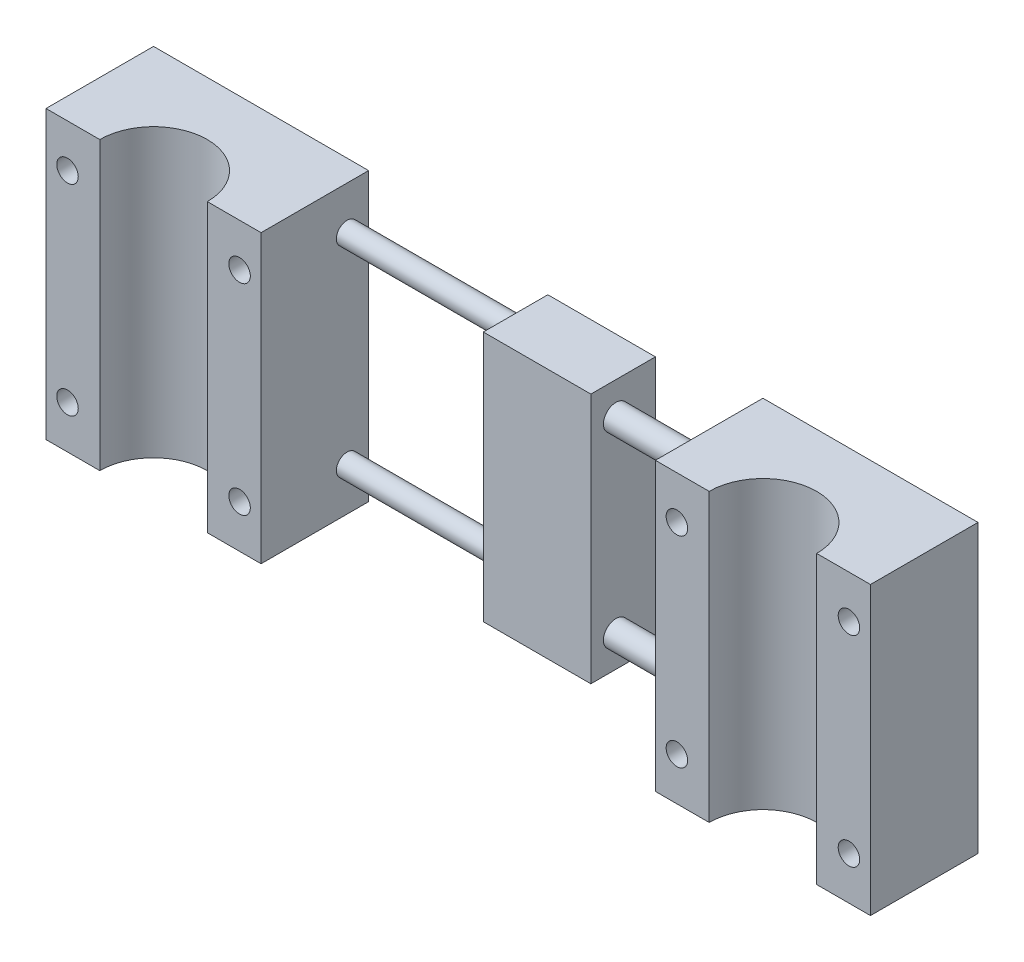
ISO-10303-21;
HEADER;
FILE_DESCRIPTION(('STEP AP214'),'2;1');
FILE_NAME('part.step','',(''),(''),'','','');
FILE_SCHEMA(('AUTOMOTIVE_DESIGN { 1 0 10303 214 1 1 1 1 }'));
ENDSEC;
DATA;
#1=APPLICATION_CONTEXT('core data for automotive mechanical design processes');
#2=APPLICATION_PROTOCOL_DEFINITION('international standard','automotive_design',2000,#1);
#3=PRODUCT_CONTEXT('',#1,'mechanical');
#4=PRODUCT('Part','Part','',(#3));
#5=PRODUCT_RELATED_PRODUCT_CATEGORY('part','',(#4));
#6=PRODUCT_DEFINITION_FORMATION('','',#4);
#7=PRODUCT_DEFINITION_CONTEXT('part definition',#1,'design');
#8=PRODUCT_DEFINITION('design','',#6,#7);
#9=PRODUCT_DEFINITION_SHAPE('','',#8);
#10=(LENGTH_UNIT() NAMED_UNIT(*) SI_UNIT(.MILLI.,.METRE.));
#11=(NAMED_UNIT(*) PLANE_ANGLE_UNIT() SI_UNIT($,.RADIAN.));
#12=(NAMED_UNIT(*) SI_UNIT($,.STERADIAN.) SOLID_ANGLE_UNIT());
#13=UNCERTAINTY_MEASURE_WITH_UNIT(LENGTH_MEASURE(1.E-05),#10,'distance_accuracy_value','');
#14=(GEOMETRIC_REPRESENTATION_CONTEXT(3) GLOBAL_UNCERTAINTY_ASSIGNED_CONTEXT((#13)) GLOBAL_UNIT_ASSIGNED_CONTEXT((#10,
#11,#12)) REPRESENTATION_CONTEXT('',''));
#15=CARTESIAN_POINT('',(0.,0.,0.));
#16=DIRECTION('',(0.,0.,1.));
#17=DIRECTION('',(1.,0.,0.));
#18=AXIS2_PLACEMENT_3D('',#15,#16,#17);
#19=CARTESIAN_POINT('',(115.,40.,15.));
#20=DIRECTION('',(0.,0.,-1.));
#21=DIRECTION('',(-1.,0.,0.));
#22=AXIS2_PLACEMENT_3D('',#19,#20,#21);
#23=PLANE('',#22);
#24=CARTESIAN_POINT('',(88.,6.,15.));
#25=DIRECTION('',(0.,0.,1.));
#26=DIRECTION('',(1.,0.,0.));
#27=AXIS2_PLACEMENT_3D('',#24,#25,#26);
#28=CIRCLE('',#27,1.5);
#29=CARTESIAN_POINT('',(89.5,6.,15.));
#30=VERTEX_POINT('',#29);
#31=EDGE_CURVE('E370',#30,#30,#28,.T.);
#32=ORIENTED_EDGE('',*,*,#31,.F.);
#33=EDGE_LOOP('',(#32));
#34=FACE_BOUND('',#33,.T.);
#35=CARTESIAN_POINT('',(88.,34.,15.));
#36=DIRECTION('',(0.,0.,1.));
#37=DIRECTION('',(1.,0.,0.));
#38=AXIS2_PLACEMENT_3D('',#35,#36,#37);
#39=CIRCLE('',#38,1.5);
#40=CARTESIAN_POINT('',(89.5,34.,15.));
#41=VERTEX_POINT('',#40);
#42=EDGE_CURVE('E298',#41,#41,#39,.T.);
#43=ORIENTED_EDGE('',*,*,#42,.F.);
#44=EDGE_LOOP('',(#43));
#45=FACE_BOUND('',#44,.T.);
#46=DIRECTION('',(-1.,0.,0.));
#47=VECTOR('',#46,1.);
#48=CARTESIAN_POINT('',(115.,0.,15.));
#49=LINE('',#48,#47);
#50=CARTESIAN_POINT('',(92.5,0.,15.));
#51=VERTEX_POINT('',#50);
#52=CARTESIAN_POINT('',(85.,0.,15.));
#53=VERTEX_POINT('',#52);
#54=EDGE_CURVE('E164',#51,#53,#49,.T.);
#55=ORIENTED_EDGE('',*,*,#54,.F.);
#56=DIRECTION('',(0.,1.,0.));
#57=VECTOR('',#56,1.);
#58=CARTESIAN_POINT('',(92.5,-19.,15.));
#59=LINE('',#58,#57);
#60=CARTESIAN_POINT('',(92.5,40.,15.));
#61=VERTEX_POINT('',#60);
#62=EDGE_CURVE('E54',#51,#61,#59,.T.);
#63=ORIENTED_EDGE('',*,*,#62,.T.);
#64=DIRECTION('',(-1.,0.,0.));
#65=VECTOR('',#64,1.);
#66=CARTESIAN_POINT('',(115.,40.,15.));
#67=LINE('',#66,#65);
#68=CARTESIAN_POINT('',(85.,40.,15.));
#69=VERTEX_POINT('',#68);
#70=EDGE_CURVE('E162',#61,#69,#67,.T.);
#71=ORIENTED_EDGE('',*,*,#70,.T.);
#72=DIRECTION('',(0.,-1.,0.));
#73=VECTOR('',#72,1.);
#74=CARTESIAN_POINT('',(85.,40.,15.));
#75=LINE('',#74,#73);
#76=EDGE_CURVE('E326',#69,#53,#75,.T.);
#77=ORIENTED_EDGE('',*,*,#76,.T.);
#78=EDGE_LOOP('',(#55,#63,#71,#77));
#79=FACE_BOUND('',#78,.T.);
#80=ADVANCED_FACE('F37',(#34,#45,#79),#23,.F.);
#81=CARTESIAN_POINT('',(0.,0.,15.));
#82=DIRECTION('',(0.,0.,-1.));
#83=DIRECTION('',(-1.,0.,0.));
#84=AXIS2_PLACEMENT_3D('',#81,#82,#83);
#85=PLANE('',#84);
#86=CARTESIAN_POINT('',(3.,6.,15.));
#87=DIRECTION('',(0.,0.,1.));
#88=DIRECTION('',(1.,0.,0.));
#89=AXIS2_PLACEMENT_3D('',#86,#87,#88);
#90=CIRCLE('',#89,1.5);
#91=CARTESIAN_POINT('',(4.5,6.,15.));
#92=VERTEX_POINT('',#91);
#93=EDGE_CURVE('E222',#92,#92,#90,.T.);
#94=ORIENTED_EDGE('',*,*,#93,.F.);
#95=EDGE_LOOP('',(#94));
#96=FACE_BOUND('',#95,.T.);
#97=CARTESIAN_POINT('',(3.,34.,15.));
#98=DIRECTION('',(0.,0.,1.));
#99=DIRECTION('',(1.,0.,0.));
#100=AXIS2_PLACEMENT_3D('',#97,#98,#99);
#101=CIRCLE('',#100,1.5);
#102=CARTESIAN_POINT('',(4.5,34.,15.));
#103=VERTEX_POINT('',#102);
#104=EDGE_CURVE('E231',#103,#103,#101,.T.);
#105=ORIENTED_EDGE('',*,*,#104,.F.);
#106=EDGE_LOOP('',(#105));
#107=FACE_BOUND('',#106,.T.);
#108=DIRECTION('',(1.,0.,0.));
#109=VECTOR('',#108,1.);
#110=CARTESIAN_POINT('',(0.,0.,15.));
#111=LINE('',#110,#109);
#112=CARTESIAN_POINT('',(0.,0.,15.));
#113=VERTEX_POINT('',#112);
#114=CARTESIAN_POINT('',(7.5,0.,15.));
#115=VERTEX_POINT('',#114);
#116=EDGE_CURVE('E245',#113,#115,#111,.T.);
#117=ORIENTED_EDGE('',*,*,#116,.T.);
#118=DIRECTION('',(0.,1.,0.));
#119=VECTOR('',#118,1.);
#120=CARTESIAN_POINT('',(7.5,-9.00000000000001,15.));
#121=LINE('',#120,#119);
#122=CARTESIAN_POINT('',(7.5,40.,15.));
#123=VERTEX_POINT('',#122);
#124=EDGE_CURVE('E275',#115,#123,#121,.T.);
#125=ORIENTED_EDGE('',*,*,#124,.T.);
#126=DIRECTION('',(-1.,0.,0.));
#127=VECTOR('',#126,1.);
#128=CARTESIAN_POINT('',(0.,40.,15.));
#129=LINE('',#128,#127);
#130=CARTESIAN_POINT('',(0.,40.,15.));
#131=VERTEX_POINT('',#130);
#132=EDGE_CURVE('E250',#123,#131,#129,.T.);
#133=ORIENTED_EDGE('',*,*,#132,.T.);
#134=DIRECTION('',(0.,-1.,0.));
#135=VECTOR('',#134,1.);
#136=CARTESIAN_POINT('',(0.,0.,15.));
#137=LINE('',#136,#135);
#138=EDGE_CURVE('E240',#131,#113,#137,.T.);
#139=ORIENTED_EDGE('',*,*,#138,.T.);
#140=EDGE_LOOP('',(#117,#125,#133,#139));
#141=FACE_BOUND('',#140,.T.);
#142=ADVANCED_FACE('F359',(#96,#107,#141),#85,.F.);
#143=CARTESIAN_POINT('',(0.,0.,15.));
#144=DIRECTION('',(1.,0.,0.));
#145=DIRECTION('',(0.,0.,-1.));
#146=AXIS2_PLACEMENT_3D('',#143,#144,#145);
#147=PLANE('',#146);
#148=DIRECTION('',(0.,-1.,0.));
#149=VECTOR('',#148,1.);
#150=CARTESIAN_POINT('',(0.,0.,0.));
#151=LINE('',#150,#149);
#152=CARTESIAN_POINT('',(0.,40.,0.));
#153=VERTEX_POINT('',#152);
#154=CARTESIAN_POINT('',(0.,0.,0.));
#155=VERTEX_POINT('',#154);
#156=EDGE_CURVE('E239',#153,#155,#151,.T.);
#157=ORIENTED_EDGE('',*,*,#156,.T.);
#158=DIRECTION('',(0.,0.,-1.));
#159=VECTOR('',#158,1.);
#160=CARTESIAN_POINT('',(0.,0.,15.));
#161=LINE('',#160,#159);
#162=EDGE_CURVE('E270',#113,#155,#161,.T.);
#163=ORIENTED_EDGE('',*,*,#162,.F.);
#164=ORIENTED_EDGE('',*,*,#138,.F.);
#165=DIRECTION('',(0.,0.,-1.));
#166=VECTOR('',#165,1.);
#167=CARTESIAN_POINT('',(0.,40.,15.));
#168=LINE('',#167,#166);
#169=EDGE_CURVE('E254',#131,#153,#168,.T.);
#170=ORIENTED_EDGE('',*,*,#169,.T.);
#171=EDGE_LOOP('',(#157,#163,#164,#170));
#172=FACE_BOUND('',#171,.T.);
#173=ADVANCED_FACE('F39',(#172),#147,.F.);
#174=CARTESIAN_POINT('',(0.,0.,15.));
#175=DIRECTION('',(0.,1.,0.));
#176=DIRECTION('',(0.,0.,1.));
#177=AXIS2_PLACEMENT_3D('',#174,#175,#176);
#178=PLANE('',#177);
#179=CARTESIAN_POINT('',(22.5,0.,15.));
#180=VERTEX_POINT('',#179);
#181=CARTESIAN_POINT('',(30.,0.,15.));
#182=VERTEX_POINT('',#181);
#183=EDGE_CURVE('E243',#180,#182,#111,.T.);
#184=ORIENTED_EDGE('',*,*,#183,.F.);
#185=CARTESIAN_POINT('',(15.,0.,15.));
#186=DIRECTION('',(0.,1.,0.));
#187=DIRECTION('',(0.,0.,1.));
#188=AXIS2_PLACEMENT_3D('',#185,#186,#187);
#189=CIRCLE('',#188,7.5);
#190=EDGE_CURVE('E61',#180,#115,#189,.T.);
#191=ORIENTED_EDGE('',*,*,#190,.T.);
#192=ORIENTED_EDGE('',*,*,#116,.F.);
#193=ORIENTED_EDGE('',*,*,#162,.T.);
#194=DIRECTION('',(1.,0.,0.));
#195=VECTOR('',#194,1.);
#196=CARTESIAN_POINT('',(0.,0.,0.));
#197=LINE('',#196,#195);
#198=CARTESIAN_POINT('',(30.,0.,0.));
#199=VERTEX_POINT('',#198);
#200=EDGE_CURVE('E257',#155,#199,#197,.T.);
#201=ORIENTED_EDGE('',*,*,#200,.T.);
#202=DIRECTION('',(0.,0.,-1.));
#203=VECTOR('',#202,1.);
#204=CARTESIAN_POINT('',(30.,0.,15.));
#205=LINE('',#204,#203);
#206=EDGE_CURVE('E267',#182,#199,#205,.T.);
#207=ORIENTED_EDGE('',*,*,#206,.F.);
#208=EDGE_LOOP('',(#184,#191,#192,#193,#201,#207));
#209=FACE_BOUND('',#208,.T.);
#210=ADVANCED_FACE('F509',(#209),#178,.F.);
#211=CARTESIAN_POINT('',(30.,0.,15.));
#212=DIRECTION('',(-1.,0.,0.));
#213=DIRECTION('',(0.,0.,1.));
#214=AXIS2_PLACEMENT_3D('',#211,#212,#213);
#215=PLANE('',#214);
#216=CARTESIAN_POINT('',(30.,6.,3.));
#217=DIRECTION('',(-1.,0.,0.));
#218=DIRECTION('',(0.,0.,1.));
#219=AXIS2_PLACEMENT_3D('',#216,#217,#218);
#220=CIRCLE('',#219,1.5);
#221=CARTESIAN_POINT('',(30.,6.,4.5));
#222=VERTEX_POINT('',#221);
#223=EDGE_CURVE('E290',#222,#222,#220,.F.);
#224=ORIENTED_EDGE('',*,*,#223,.F.);
#225=EDGE_LOOP('',(#224));
#226=FACE_BOUND('',#225,.T.);
#227=CARTESIAN_POINT('',(30.,34.,3.));
#228=DIRECTION('',(-1.,0.,0.));
#229=DIRECTION('',(0.,0.,1.));
#230=AXIS2_PLACEMENT_3D('',#227,#228,#229);
#231=CIRCLE('',#230,1.5);
#232=CARTESIAN_POINT('',(30.,34.,4.5));
#233=VERTEX_POINT('',#232);
#234=EDGE_CURVE('E278',#233,#233,#231,.F.);
#235=ORIENTED_EDGE('',*,*,#234,.F.);
#236=EDGE_LOOP('',(#235));
#237=FACE_BOUND('',#236,.T.);
#238=DIRECTION('',(0.,1.,0.));
#239=VECTOR('',#238,1.);
#240=CARTESIAN_POINT('',(30.,0.,0.));
#241=LINE('',#240,#239);
#242=CARTESIAN_POINT('',(30.,40.,0.));
#243=VERTEX_POINT('',#242);
#244=EDGE_CURVE('E259',#199,#243,#241,.T.);
#245=ORIENTED_EDGE('',*,*,#244,.T.);
#246=DIRECTION('',(0.,0.,-1.));
#247=VECTOR('',#246,1.);
#248=CARTESIAN_POINT('',(30.,40.,15.));
#249=LINE('',#248,#247);
#250=CARTESIAN_POINT('',(30.,40.,15.));
#251=VERTEX_POINT('',#250);
#252=EDGE_CURVE('E264',#251,#243,#249,.T.);
#253=ORIENTED_EDGE('',*,*,#252,.F.);
#254=DIRECTION('',(0.,1.,0.));
#255=VECTOR('',#254,1.);
#256=CARTESIAN_POINT('',(30.,0.,15.));
#257=LINE('',#256,#255);
#258=EDGE_CURVE('E248',#182,#251,#257,.T.);
#259=ORIENTED_EDGE('',*,*,#258,.F.);
#260=ORIENTED_EDGE('',*,*,#206,.T.);
#261=EDGE_LOOP('',(#245,#253,#259,#260));
#262=FACE_BOUND('',#261,.T.);
#263=ADVANCED_FACE('F506',(#226,#237,#262),#215,.F.);
#264=CARTESIAN_POINT('',(0.,40.,15.));
#265=DIRECTION('',(0.,-1.,0.));
#266=DIRECTION('',(0.,0.,-1.));
#267=AXIS2_PLACEMENT_3D('',#264,#265,#266);
#268=PLANE('',#267);
#269=ORIENTED_EDGE('',*,*,#132,.F.);
#270=CARTESIAN_POINT('',(15.,40.,15.));
#271=DIRECTION('',(0.,1.,0.));
#272=DIRECTION('',(0.,0.,1.));
#273=AXIS2_PLACEMENT_3D('',#270,#271,#272);
#274=CIRCLE('',#273,7.5);
#275=CARTESIAN_POINT('',(22.5,40.,15.));
#276=VERTEX_POINT('',#275);
#277=EDGE_CURVE('E236',#276,#123,#274,.T.);
#278=ORIENTED_EDGE('',*,*,#277,.F.);
#279=EDGE_CURVE('E251',#251,#276,#129,.T.);
#280=ORIENTED_EDGE('',*,*,#279,.F.);
#281=ORIENTED_EDGE('',*,*,#252,.T.);
#282=DIRECTION('',(-1.,0.,0.));
#283=VECTOR('',#282,1.);
#284=CARTESIAN_POINT('',(0.,40.,0.));
#285=LINE('',#284,#283);
#286=EDGE_CURVE('E244',#243,#153,#285,.T.);
#287=ORIENTED_EDGE('',*,*,#286,.T.);
#288=ORIENTED_EDGE('',*,*,#169,.F.);
#289=EDGE_LOOP('',(#269,#278,#280,#281,#287,#288));
#290=FACE_BOUND('',#289,.T.);
#291=ADVANCED_FACE('F499',(#290),#268,.F.);
#292=CARTESIAN_POINT('',(27.,34.,15.));
#293=DIRECTION('',(0.,0.,1.));
#294=DIRECTION('',(1.,0.,0.));
#295=AXIS2_PLACEMENT_3D('',#292,#293,#294);
#296=CIRCLE('',#295,1.5);
#297=CARTESIAN_POINT('',(28.5,34.,15.));
#298=VERTEX_POINT('',#297);
#299=EDGE_CURVE('E226',#298,#298,#296,.T.);
#300=ORIENTED_EDGE('',*,*,#299,.F.);
#301=EDGE_LOOP('',(#300));
#302=FACE_BOUND('',#301,.T.);
#303=CARTESIAN_POINT('',(27.,6.,15.));
#304=DIRECTION('',(0.,0.,1.));
#305=DIRECTION('',(1.,0.,0.));
#306=AXIS2_PLACEMENT_3D('',#303,#304,#305);
#307=CIRCLE('',#306,1.5);
#308=CARTESIAN_POINT('',(28.5,6.,15.));
#309=VERTEX_POINT('',#308);
#310=EDGE_CURVE('E221',#309,#309,#307,.T.);
#311=ORIENTED_EDGE('',*,*,#310,.F.);
#312=EDGE_LOOP('',(#311));
#313=FACE_BOUND('',#312,.T.);
#314=ORIENTED_EDGE('',*,*,#279,.T.);
#315=DIRECTION('',(0.,1.,0.));
#316=VECTOR('',#315,1.);
#317=CARTESIAN_POINT('',(22.5,-9.00000000000001,15.));
#318=LINE('',#317,#316);
#319=EDGE_CURVE('E273',#276,#180,#318,.F.);
#320=ORIENTED_EDGE('',*,*,#319,.T.);
#321=ORIENTED_EDGE('',*,*,#183,.T.);
#322=ORIENTED_EDGE('',*,*,#258,.T.);
#323=EDGE_LOOP('',(#314,#320,#321,#322));
#324=FACE_BOUND('',#323,.T.);
#325=ADVANCED_FACE('F366',(#302,#313,#324),#85,.F.);
#326=CARTESIAN_POINT('',(0.,0.,0.));
#327=DIRECTION('',(0.,0.,-1.));
#328=DIRECTION('',(-1.,0.,0.));
#329=AXIS2_PLACEMENT_3D('',#326,#327,#328);
#330=PLANE('',#329);
#331=CARTESIAN_POINT('',(3.,6.,0.));
#332=DIRECTION('',(0.,0.,-1.));
#333=DIRECTION('',(-1.,0.,0.));
#334=AXIS2_PLACEMENT_3D('',#331,#332,#333);
#335=CIRCLE('',#334,1.5);
#336=CARTESIAN_POINT('',(1.5,6.,0.));
#337=VERTEX_POINT('',#336);
#338=EDGE_CURVE('E235',#337,#337,#335,.T.);
#339=ORIENTED_EDGE('',*,*,#338,.F.);
#340=EDGE_LOOP('',(#339));
#341=FACE_BOUND('',#340,.T.);
#342=CARTESIAN_POINT('',(27.,34.,0.));
#343=DIRECTION('',(0.,0.,-1.));
#344=DIRECTION('',(-1.,0.,0.));
#345=AXIS2_PLACEMENT_3D('',#342,#343,#344);
#346=CIRCLE('',#345,1.5);
#347=CARTESIAN_POINT('',(25.5,34.,0.));
#348=VERTEX_POINT('',#347);
#349=EDGE_CURVE('E283',#348,#348,#346,.T.);
#350=ORIENTED_EDGE('',*,*,#349,.F.);
#351=EDGE_LOOP('',(#350));
#352=FACE_BOUND('',#351,.T.);
#353=CARTESIAN_POINT('',(27.,6.,0.));
#354=DIRECTION('',(0.,0.,-1.));
#355=DIRECTION('',(-1.,0.,0.));
#356=AXIS2_PLACEMENT_3D('',#353,#354,#355);
#357=CIRCLE('',#356,1.5);
#358=CARTESIAN_POINT('',(25.5,6.,0.));
#359=VERTEX_POINT('',#358);
#360=EDGE_CURVE('E225',#359,#359,#357,.T.);
#361=ORIENTED_EDGE('',*,*,#360,.F.);
#362=EDGE_LOOP('',(#361));
#363=FACE_BOUND('',#362,.T.);
#364=CARTESIAN_POINT('',(3.,34.,0.));
#365=DIRECTION('',(0.,0.,-1.));
#366=DIRECTION('',(-1.,0.,0.));
#367=AXIS2_PLACEMENT_3D('',#364,#365,#366);
#368=CIRCLE('',#367,1.5);
#369=CARTESIAN_POINT('',(1.5,34.,0.));
#370=VERTEX_POINT('',#369);
#371=EDGE_CURVE('E234',#370,#370,#368,.T.);
#372=ORIENTED_EDGE('',*,*,#371,.F.);
#373=EDGE_LOOP('',(#372));
#374=FACE_BOUND('',#373,.T.);
#375=ORIENTED_EDGE('',*,*,#156,.F.);
#376=ORIENTED_EDGE('',*,*,#286,.F.);
#377=ORIENTED_EDGE('',*,*,#244,.F.);
#378=ORIENTED_EDGE('',*,*,#200,.F.);
#379=EDGE_LOOP('',(#375,#376,#377,#378));
#380=FACE_BOUND('',#379,.T.);
#381=ADVANCED_FACE('F496',(#341,#352,#363,#374,#380),#330,.T.);
#382=CARTESIAN_POINT('',(15.,-9.00000000000001,15.));
#383=DIRECTION('',(0.,1.,0.));
#384=DIRECTION('',(0.,0.,1.));
#385=AXIS2_PLACEMENT_3D('',#382,#383,#384);
#386=CYLINDRICAL_SURFACE('',#385,7.5);
#387=ORIENTED_EDGE('',*,*,#319,.F.);
#388=ORIENTED_EDGE('',*,*,#277,.T.);
#389=ORIENTED_EDGE('',*,*,#124,.F.);
#390=ORIENTED_EDGE('',*,*,#190,.F.);
#391=EDGE_LOOP('',(#387,#388,#389,#390));
#392=FACE_BOUND('',#391,.T.);
#393=ADVANCED_FACE('F493',(#392),#386,.F.);
#394=CARTESIAN_POINT('',(3.,34.,-34.));
#395=DIRECTION('',(0.,0.,1.));
#396=DIRECTION('',(1.,0.,0.));
#397=AXIS2_PLACEMENT_3D('',#394,#395,#396);
#398=CYLINDRICAL_SURFACE('',#397,1.5);
#399=ORIENTED_EDGE('',*,*,#371,.T.);
#400=EDGE_LOOP('',(#399));
#401=FACE_BOUND('',#400,.T.);
#402=ORIENTED_EDGE('',*,*,#104,.T.);
#403=EDGE_LOOP('',(#402));
#404=FACE_BOUND('',#403,.T.);
#405=ADVANCED_FACE('F489',(#401,#404),#398,.F.);
#406=CARTESIAN_POINT('',(27.,6.,-34.));
#407=DIRECTION('',(0.,0.,1.));
#408=DIRECTION('',(1.,0.,0.));
#409=AXIS2_PLACEMENT_3D('',#406,#407,#408);
#410=CYLINDRICAL_SURFACE('',#409,1.5);
#411=ORIENTED_EDGE('',*,*,#360,.T.);
#412=EDGE_LOOP('',(#411));
#413=FACE_BOUND('',#412,.T.);
#414=ORIENTED_EDGE('',*,*,#310,.T.);
#415=EDGE_LOOP('',(#414));
#416=FACE_BOUND('',#415,.T.);
#417=ADVANCED_FACE('F485',(#413,#416),#410,.F.);
#418=CARTESIAN_POINT('',(27.,34.,-34.));
#419=DIRECTION('',(0.,0.,1.));
#420=DIRECTION('',(1.,0.,0.));
#421=AXIS2_PLACEMENT_3D('',#418,#419,#420);
#422=CYLINDRICAL_SURFACE('',#421,1.5);
#423=ORIENTED_EDGE('',*,*,#349,.T.);
#424=EDGE_LOOP('',(#423));
#425=FACE_BOUND('',#424,.T.);
#426=ORIENTED_EDGE('',*,*,#299,.T.);
#427=EDGE_LOOP('',(#426));
#428=FACE_BOUND('',#427,.T.);
#429=ADVANCED_FACE('F481',(#425,#428),#422,.F.);
#430=CARTESIAN_POINT('',(3.,6.,-34.));
#431=DIRECTION('',(0.,0.,1.));
#432=DIRECTION('',(1.,0.,0.));
#433=AXIS2_PLACEMENT_3D('',#430,#431,#432);
#434=CYLINDRICAL_SURFACE('',#433,1.5);
#435=ORIENTED_EDGE('',*,*,#338,.T.);
#436=EDGE_LOOP('',(#435));
#437=FACE_BOUND('',#436,.T.);
#438=ORIENTED_EDGE('',*,*,#93,.T.);
#439=EDGE_LOOP('',(#438));
#440=FACE_BOUND('',#439,.T.);
#441=ADVANCED_FACE('F477',(#437,#440),#434,.F.);
#442=CARTESIAN_POINT('',(55.,34.,3.));
#443=DIRECTION('',(-1.,0.,0.));
#444=DIRECTION('',(0.,0.,1.));
#445=AXIS2_PLACEMENT_3D('',#442,#443,#444);
#446=CYLINDRICAL_SURFACE('',#445,1.5);
#447=CARTESIAN_POINT('',(55.,34.,3.));
#448=DIRECTION('',(1.,0.,0.));
#449=DIRECTION('',(0.,0.,-1.));
#450=AXIS2_PLACEMENT_3D('',#447,#448,#449);
#451=CIRCLE('',#450,1.5);
#452=CARTESIAN_POINT('',(55.,34.,1.5));
#453=VERTEX_POINT('',#452);
#454=EDGE_CURVE('E218',#453,#453,#451,.T.);
#455=ORIENTED_EDGE('',*,*,#454,.F.);
#456=EDGE_LOOP('',(#455));
#457=FACE_BOUND('',#456,.T.);
#458=ORIENTED_EDGE('',*,*,#234,.T.);
#459=EDGE_LOOP('',(#458));
#460=FACE_BOUND('',#459,.T.);
#461=ADVANCED_FACE('F473',(#457,#460),#446,.T.);
#462=CARTESIAN_POINT('',(55.,6.,3.));
#463=DIRECTION('',(-1.,0.,0.));
#464=DIRECTION('',(0.,0.,1.));
#465=AXIS2_PLACEMENT_3D('',#462,#463,#464);
#466=CYLINDRICAL_SURFACE('',#465,1.5);
#467=CARTESIAN_POINT('',(55.,6.,3.));
#468=DIRECTION('',(1.,0.,0.));
#469=DIRECTION('',(0.,0.,-1.));
#470=AXIS2_PLACEMENT_3D('',#467,#468,#469);
#471=CIRCLE('',#470,1.5);
#472=CARTESIAN_POINT('',(55.,6.,1.5));
#473=VERTEX_POINT('',#472);
#474=EDGE_CURVE('E215',#473,#473,#471,.T.);
#475=ORIENTED_EDGE('',*,*,#474,.F.);
#476=EDGE_LOOP('',(#475));
#477=FACE_BOUND('',#476,.T.);
#478=ORIENTED_EDGE('',*,*,#223,.T.);
#479=EDGE_LOOP('',(#478));
#480=FACE_BOUND('',#479,.T.);
#481=ADVANCED_FACE('F470',(#477,#480),#466,.T.);
#482=CARTESIAN_POINT('',(70.,37.5,0.));
#483=DIRECTION('',(0.,0.,1.));
#484=DIRECTION('',(0.,-1.,0.));
#485=AXIS2_PLACEMENT_3D('',#482,#483,#484);
#486=PLANE('',#485);
#487=DIRECTION('',(0.,1.,0.));
#488=VECTOR('',#487,1.);
#489=CARTESIAN_POINT('',(55.,37.5,0.));
#490=LINE('',#489,#488);
#491=CARTESIAN_POINT('',(55.,2.5,0.));
#492=VERTEX_POINT('',#491);
#493=CARTESIAN_POINT('',(55.,37.5,0.));
#494=VERTEX_POINT('',#493);
#495=EDGE_CURVE('E185',#492,#494,#490,.T.);
#496=ORIENTED_EDGE('',*,*,#495,.T.);
#497=DIRECTION('',(-1.,0.,0.));
#498=VECTOR('',#497,1.);
#499=CARTESIAN_POINT('',(70.,37.5,0.));
#500=LINE('',#499,#498);
#501=CARTESIAN_POINT('',(70.,37.5,0.));
#502=VERTEX_POINT('',#501);
#503=EDGE_CURVE('E212',#502,#494,#500,.T.);
#504=ORIENTED_EDGE('',*,*,#503,.F.);
#505=DIRECTION('',(0.,1.,0.));
#506=VECTOR('',#505,1.);
#507=CARTESIAN_POINT('',(70.,37.5,0.));
#508=LINE('',#507,#506);
#509=CARTESIAN_POINT('',(70.,2.5,0.));
#510=VERTEX_POINT('',#509);
#511=EDGE_CURVE('E186',#510,#502,#508,.T.);
#512=ORIENTED_EDGE('',*,*,#511,.F.);
#513=DIRECTION('',(-1.,0.,0.));
#514=VECTOR('',#513,1.);
#515=CARTESIAN_POINT('',(70.,2.5,0.));
#516=LINE('',#515,#514);
#517=EDGE_CURVE('E196',#510,#492,#516,.T.);
#518=ORIENTED_EDGE('',*,*,#517,.T.);
#519=EDGE_LOOP('',(#496,#504,#512,#518));
#520=FACE_BOUND('',#519,.T.);
#521=ADVANCED_FACE('F440',(#520),#486,.F.);
#522=CARTESIAN_POINT('',(70.,37.5,0.));
#523=DIRECTION('',(0.,-1.,0.));
#524=DIRECTION('',(0.,0.,-1.));
#525=AXIS2_PLACEMENT_3D('',#522,#523,#524);
#526=PLANE('',#525);
#527=DIRECTION('',(0.,0.,1.));
#528=VECTOR('',#527,1.);
#529=CARTESIAN_POINT('',(55.,37.5,0.));
#530=LINE('',#529,#528);
#531=CARTESIAN_POINT('',(55.,37.5,9.));
#532=VERTEX_POINT('',#531);
#533=EDGE_CURVE('E199',#494,#532,#530,.T.);
#534=ORIENTED_EDGE('',*,*,#533,.T.);
#535=DIRECTION('',(-1.,0.,0.));
#536=VECTOR('',#535,1.);
#537=CARTESIAN_POINT('',(70.,37.5,9.));
#538=LINE('',#537,#536);
#539=CARTESIAN_POINT('',(70.,37.5,9.));
#540=VERTEX_POINT('',#539);
#541=EDGE_CURVE('E209',#540,#532,#538,.T.);
#542=ORIENTED_EDGE('',*,*,#541,.F.);
#543=DIRECTION('',(0.,0.,1.));
#544=VECTOR('',#543,1.);
#545=CARTESIAN_POINT('',(70.,37.5,0.));
#546=LINE('',#545,#544);
#547=EDGE_CURVE('E189',#502,#540,#546,.T.);
#548=ORIENTED_EDGE('',*,*,#547,.F.);
#549=ORIENTED_EDGE('',*,*,#503,.T.);
#550=EDGE_LOOP('',(#534,#542,#548,#549));
#551=FACE_BOUND('',#550,.T.);
#552=ADVANCED_FACE('F443',(#551),#526,.F.);
#553=CARTESIAN_POINT('',(70.,37.5,9.));
#554=DIRECTION('',(0.,0.,-1.));
#555=DIRECTION('',(0.,1.,0.));
#556=AXIS2_PLACEMENT_3D('',#553,#554,#555);
#557=PLANE('',#556);
#558=DIRECTION('',(0.,-1.,0.));
#559=VECTOR('',#558,1.);
#560=CARTESIAN_POINT('',(55.,37.5,9.));
#561=LINE('',#560,#559);
#562=CARTESIAN_POINT('',(55.,2.5,9.));
#563=VERTEX_POINT('',#562);
#564=EDGE_CURVE('E201',#532,#563,#561,.T.);
#565=ORIENTED_EDGE('',*,*,#564,.T.);
#566=DIRECTION('',(-1.,0.,0.));
#567=VECTOR('',#566,1.);
#568=CARTESIAN_POINT('',(70.,2.5,9.));
#569=LINE('',#568,#567);
#570=CARTESIAN_POINT('',(70.,2.5,9.));
#571=VERTEX_POINT('',#570);
#572=EDGE_CURVE('E206',#571,#563,#569,.T.);
#573=ORIENTED_EDGE('',*,*,#572,.F.);
#574=DIRECTION('',(0.,-1.,0.));
#575=VECTOR('',#574,1.);
#576=CARTESIAN_POINT('',(70.,37.5,9.));
#577=LINE('',#576,#575);
#578=EDGE_CURVE('E192',#540,#571,#577,.T.);
#579=ORIENTED_EDGE('',*,*,#578,.F.);
#580=ORIENTED_EDGE('',*,*,#541,.T.);
#581=EDGE_LOOP('',(#565,#573,#579,#580));
#582=FACE_BOUND('',#581,.T.);
#583=ADVANCED_FACE('F448',(#582),#557,.F.);
#584=CARTESIAN_POINT('',(70.,2.5,0.));
#585=DIRECTION('',(0.,1.,0.));
#586=DIRECTION('',(0.,0.,1.));
#587=AXIS2_PLACEMENT_3D('',#584,#585,#586);
#588=PLANE('',#587);
#589=DIRECTION('',(0.,0.,-1.));
#590=VECTOR('',#589,1.);
#591=CARTESIAN_POINT('',(55.,2.5,0.));
#592=LINE('',#591,#590);
#593=EDGE_CURVE('E190',#563,#492,#592,.T.);
#594=ORIENTED_EDGE('',*,*,#593,.T.);
#595=ORIENTED_EDGE('',*,*,#517,.F.);
#596=DIRECTION('',(0.,0.,-1.));
#597=VECTOR('',#596,1.);
#598=CARTESIAN_POINT('',(70.,2.5,0.));
#599=LINE('',#598,#597);
#600=EDGE_CURVE('E194',#571,#510,#599,.T.);
#601=ORIENTED_EDGE('',*,*,#600,.F.);
#602=ORIENTED_EDGE('',*,*,#572,.T.);
#603=EDGE_LOOP('',(#594,#595,#601,#602));
#604=FACE_BOUND('',#603,.T.);
#605=ADVANCED_FACE('F430',(#604),#588,.F.);
#606=CARTESIAN_POINT('',(70.,0.,0.));
#607=DIRECTION('',(-1.,0.,0.));
#608=DIRECTION('',(0.,0.,1.));
#609=AXIS2_PLACEMENT_3D('',#606,#607,#608);
#610=PLANE('',#609);
#611=CARTESIAN_POINT('',(70.,6.88748219369606,5.5));
#612=DIRECTION('',(-1.,0.,0.));
#613=DIRECTION('',(0.,0.,1.));
#614=AXIS2_PLACEMENT_3D('',#611,#612,#613);
#615=CIRCLE('',#614,1.75);
#616=CARTESIAN_POINT('',(70.,6.88748219369606,7.25));
#617=VERTEX_POINT('',#616);
#618=EDGE_CURVE('E46',#617,#617,#615,.F.);
#619=ORIENTED_EDGE('',*,*,#618,.F.);
#620=EDGE_LOOP('',(#619));
#621=FACE_BOUND('',#620,.T.);
#622=CARTESIAN_POINT('',(70.,33.,5.5));
#623=DIRECTION('',(-1.,0.,0.));
#624=DIRECTION('',(0.,0.,1.));
#625=AXIS2_PLACEMENT_3D('',#622,#623,#624);
#626=CIRCLE('',#625,1.75);
#627=CARTESIAN_POINT('',(70.,33.,7.25));
#628=VERTEX_POINT('',#627);
#629=EDGE_CURVE('E293',#628,#628,#626,.F.);
#630=ORIENTED_EDGE('',*,*,#629,.F.);
#631=EDGE_LOOP('',(#630));
#632=FACE_BOUND('',#631,.T.);
#633=ORIENTED_EDGE('',*,*,#511,.T.);
#634=ORIENTED_EDGE('',*,*,#547,.T.);
#635=ORIENTED_EDGE('',*,*,#578,.T.);
#636=ORIENTED_EDGE('',*,*,#600,.T.);
#637=EDGE_LOOP('',(#633,#634,#635,#636));
#638=FACE_BOUND('',#637,.T.);
#639=ADVANCED_FACE('F426',(#621,#632,#638),#610,.F.);
#640=CARTESIAN_POINT('',(55.,0.,0.));
#641=DIRECTION('',(-1.,0.,0.));
#642=DIRECTION('',(0.,0.,1.));
#643=AXIS2_PLACEMENT_3D('',#640,#641,#642);
#644=PLANE('',#643);
#645=ORIENTED_EDGE('',*,*,#454,.T.);
#646=EDGE_LOOP('',(#645));
#647=FACE_BOUND('',#646,.T.);
#648=ORIENTED_EDGE('',*,*,#474,.T.);
#649=EDGE_LOOP('',(#648));
#650=FACE_BOUND('',#649,.T.);
#651=ORIENTED_EDGE('',*,*,#495,.F.);
#652=ORIENTED_EDGE('',*,*,#593,.F.);
#653=ORIENTED_EDGE('',*,*,#564,.F.);
#654=ORIENTED_EDGE('',*,*,#533,.F.);
#655=EDGE_LOOP('',(#651,#652,#653,#654));
#656=FACE_BOUND('',#655,.T.);
#657=ADVANCED_FACE('F429',(#647,#650,#656),#644,.T.);
#658=CARTESIAN_POINT('',(85.,33.,5.5));
#659=DIRECTION('',(-1.,0.,0.));
#660=DIRECTION('',(0.,0.,1.));
#661=AXIS2_PLACEMENT_3D('',#658,#659,#660);
#662=CYLINDRICAL_SURFACE('',#661,1.75);
#663=CARTESIAN_POINT('',(85.,33.,5.5));
#664=DIRECTION('',(1.,0.,0.));
#665=DIRECTION('',(0.,0.,-1.));
#666=AXIS2_PLACEMENT_3D('',#663,#664,#665);
#667=CIRCLE('',#666,1.75);
#668=CARTESIAN_POINT('',(85.,33.,3.75));
#669=VERTEX_POINT('',#668);
#670=EDGE_CURVE('E182',#669,#669,#667,.T.);
#671=ORIENTED_EDGE('',*,*,#670,.F.);
#672=EDGE_LOOP('',(#671));
#673=FACE_BOUND('',#672,.T.);
#674=ORIENTED_EDGE('',*,*,#629,.T.);
#675=EDGE_LOOP('',(#674));
#676=FACE_BOUND('',#675,.T.);
#677=ADVANCED_FACE('F422',(#673,#676),#662,.T.);
#678=CARTESIAN_POINT('',(85.,6.88748219369606,5.5));
#679=DIRECTION('',(-1.,0.,0.));
#680=DIRECTION('',(0.,0.,1.));
#681=AXIS2_PLACEMENT_3D('',#678,#679,#680);
#682=CYLINDRICAL_SURFACE('',#681,1.75);
#683=CARTESIAN_POINT('',(85.,6.88748219369606,5.5));
#684=DIRECTION('',(1.,0.,0.));
#685=DIRECTION('',(0.,0.,-1.));
#686=AXIS2_PLACEMENT_3D('',#683,#684,#685);
#687=CIRCLE('',#686,1.75);
#688=CARTESIAN_POINT('',(85.,6.88748219369606,3.75));
#689=VERTEX_POINT('',#688);
#690=EDGE_CURVE('E179',#689,#689,#687,.T.);
#691=ORIENTED_EDGE('',*,*,#690,.F.);
#692=EDGE_LOOP('',(#691));
#693=FACE_BOUND('',#692,.T.);
#694=ORIENTED_EDGE('',*,*,#618,.T.);
#695=EDGE_LOOP('',(#694));
#696=FACE_BOUND('',#695,.T.);
#697=ADVANCED_FACE('F394',(#693,#696),#682,.T.);
#698=CARTESIAN_POINT('',(115.,40.,0.));
#699=DIRECTION('',(0.,0.,1.));
#700=DIRECTION('',(1.,0.,0.));
#701=AXIS2_PLACEMENT_3D('',#698,#699,#700);
#702=PLANE('',#701);
#703=CARTESIAN_POINT('',(112.,34.,0.));
#704=DIRECTION('',(0.,0.,1.));
#705=DIRECTION('',(1.,0.,0.));
#706=AXIS2_PLACEMENT_3D('',#703,#704,#705);
#707=CIRCLE('',#706,1.5);
#708=CARTESIAN_POINT('',(113.5,34.,0.));
#709=VERTEX_POINT('',#708);
#710=EDGE_CURVE('E306',#709,#709,#707,.T.);
#711=ORIENTED_EDGE('',*,*,#710,.T.);
#712=EDGE_LOOP('',(#711));
#713=FACE_BOUND('',#712,.T.);
#714=CARTESIAN_POINT('',(112.,6.,0.));
#715=DIRECTION('',(0.,0.,1.));
#716=DIRECTION('',(1.,0.,0.));
#717=AXIS2_PLACEMENT_3D('',#714,#715,#716);
#718=CIRCLE('',#717,1.5);
#719=CARTESIAN_POINT('',(113.5,6.,0.));
#720=VERTEX_POINT('',#719);
#721=EDGE_CURVE('E378',#720,#720,#718,.T.);
#722=ORIENTED_EDGE('',*,*,#721,.T.);
#723=EDGE_LOOP('',(#722));
#724=FACE_BOUND('',#723,.T.);
#725=CARTESIAN_POINT('',(88.,6.,0.));
#726=DIRECTION('',(0.,0.,1.));
#727=DIRECTION('',(1.,0.,0.));
#728=AXIS2_PLACEMENT_3D('',#725,#726,#727);
#729=CIRCLE('',#728,1.5);
#730=CARTESIAN_POINT('',(89.5,6.,0.));
#731=VERTEX_POINT('',#730);
#732=EDGE_CURVE('E41',#731,#731,#729,.T.);
#733=ORIENTED_EDGE('',*,*,#732,.T.);
#734=EDGE_LOOP('',(#733));
#735=FACE_BOUND('',#734,.T.);
#736=CARTESIAN_POINT('',(88.,34.,0.));
#737=DIRECTION('',(0.,0.,1.));
#738=DIRECTION('',(1.,0.,0.));
#739=AXIS2_PLACEMENT_3D('',#736,#737,#738);
#740=CIRCLE('',#739,1.5);
#741=CARTESIAN_POINT('',(89.5,34.,0.));
#742=VERTEX_POINT('',#741);
#743=EDGE_CURVE('E157',#742,#742,#740,.T.);
#744=ORIENTED_EDGE('',*,*,#743,.T.);
#745=EDGE_LOOP('',(#744));
#746=FACE_BOUND('',#745,.T.);
#747=DIRECTION('',(0.,1.,0.));
#748=VECTOR('',#747,1.);
#749=CARTESIAN_POINT('',(85.,40.,0.));
#750=LINE('',#749,#748);
#751=CARTESIAN_POINT('',(85.,0.,0.));
#752=VERTEX_POINT('',#751);
#753=CARTESIAN_POINT('',(85.,40.,0.));
#754=VERTEX_POINT('',#753);
#755=EDGE_CURVE('E310',#752,#754,#750,.T.);
#756=ORIENTED_EDGE('',*,*,#755,.T.);
#757=DIRECTION('',(-1.,0.,0.));
#758=VECTOR('',#757,1.);
#759=CARTESIAN_POINT('',(115.,40.,0.));
#760=LINE('',#759,#758);
#761=CARTESIAN_POINT('',(115.,40.,0.));
#762=VERTEX_POINT('',#761);
#763=EDGE_CURVE('E173',#762,#754,#760,.T.);
#764=ORIENTED_EDGE('',*,*,#763,.F.);
#765=DIRECTION('',(0.,1.,0.));
#766=VECTOR('',#765,1.);
#767=CARTESIAN_POINT('',(115.,40.,0.));
#768=LINE('',#767,#766);
#769=CARTESIAN_POINT('',(115.,0.,0.));
#770=VERTEX_POINT('',#769);
#771=EDGE_CURVE('E312',#770,#762,#768,.T.);
#772=ORIENTED_EDGE('',*,*,#771,.F.);
#773=DIRECTION('',(-1.,0.,0.));
#774=VECTOR('',#773,1.);
#775=CARTESIAN_POINT('',(115.,0.,0.));
#776=LINE('',#775,#774);
#777=EDGE_CURVE('E322',#770,#752,#776,.T.);
#778=ORIENTED_EDGE('',*,*,#777,.T.);
#779=EDGE_LOOP('',(#756,#764,#772,#778));
#780=FACE_BOUND('',#779,.T.);
#781=ADVANCED_FACE('F339',(#713,#724,#735,#746,#780),#702,.F.);
#782=CARTESIAN_POINT('',(115.,40.,0.));
#783=DIRECTION('',(0.,-1.,0.));
#784=DIRECTION('',(0.,0.,-1.));
#785=AXIS2_PLACEMENT_3D('',#782,#783,#784);
#786=PLANE('',#785);
#787=ORIENTED_EDGE('',*,*,#70,.F.);
#788=CARTESIAN_POINT('',(100.,40.,15.));
#789=DIRECTION('',(0.,1.,0.));
#790=DIRECTION('',(0.,0.,1.));
#791=AXIS2_PLACEMENT_3D('',#788,#789,#790);
#792=CIRCLE('',#791,7.50000000000001);
#793=CARTESIAN_POINT('',(107.5,40.,15.));
#794=VERTEX_POINT('',#793);
#795=EDGE_CURVE('E149',#794,#61,#792,.T.);
#796=ORIENTED_EDGE('',*,*,#795,.F.);
#797=CARTESIAN_POINT('',(115.,40.,15.));
#798=VERTEX_POINT('',#797);
#799=EDGE_CURVE('E170',#798,#794,#67,.T.);
#800=ORIENTED_EDGE('',*,*,#799,.F.);
#801=DIRECTION('',(0.,0.,1.));
#802=VECTOR('',#801,1.);
#803=CARTESIAN_POINT('',(115.,40.,0.));
#804=LINE('',#803,#802);
#805=EDGE_CURVE('E315',#762,#798,#804,.T.);
#806=ORIENTED_EDGE('',*,*,#805,.F.);
#807=ORIENTED_EDGE('',*,*,#763,.T.);
#808=DIRECTION('',(0.,0.,1.));
#809=VECTOR('',#808,1.);
#810=CARTESIAN_POINT('',(85.,40.,0.));
#811=LINE('',#810,#809);
#812=EDGE_CURVE('E168',#754,#69,#811,.T.);
#813=ORIENTED_EDGE('',*,*,#812,.T.);
#814=EDGE_LOOP('',(#787,#796,#800,#806,#807,#813));
#815=FACE_BOUND('',#814,.T.);
#816=ADVANCED_FACE('F166',(#815),#786,.F.);
#817=CARTESIAN_POINT('',(112.,34.,15.));
#818=DIRECTION('',(0.,0.,1.));
#819=DIRECTION('',(1.,0.,0.));
#820=AXIS2_PLACEMENT_3D('',#817,#818,#819);
#821=CIRCLE('',#820,1.5);
#822=CARTESIAN_POINT('',(113.5,34.,15.));
#823=VERTEX_POINT('',#822);
#824=EDGE_CURVE('E375',#823,#823,#821,.T.);
#825=ORIENTED_EDGE('',*,*,#824,.F.);
#826=EDGE_LOOP('',(#825));
#827=FACE_BOUND('',#826,.T.);
#828=CARTESIAN_POINT('',(112.,6.,15.));
#829=DIRECTION('',(0.,0.,1.));
#830=DIRECTION('',(1.,0.,0.));
#831=AXIS2_PLACEMENT_3D('',#828,#829,#830);
#832=CIRCLE('',#831,1.5);
#833=CARTESIAN_POINT('',(113.5,6.,15.));
#834=VERTEX_POINT('',#833);
#835=EDGE_CURVE('E372',#834,#834,#832,.T.);
#836=ORIENTED_EDGE('',*,*,#835,.F.);
#837=EDGE_LOOP('',(#836));
#838=FACE_BOUND('',#837,.T.);
#839=ORIENTED_EDGE('',*,*,#799,.T.);
#840=DIRECTION('',(0.,1.,0.));
#841=VECTOR('',#840,1.);
#842=CARTESIAN_POINT('',(107.5,-19.,15.));
#843=LINE('',#842,#841);
#844=CARTESIAN_POINT('',(107.5,0.,15.));
#845=VERTEX_POINT('',#844);
#846=EDGE_CURVE('E152',#845,#794,#843,.T.);
#847=ORIENTED_EDGE('',*,*,#846,.F.);
#848=CARTESIAN_POINT('',(115.,0.,15.));
#849=VERTEX_POINT('',#848);
#850=EDGE_CURVE('E171',#849,#845,#49,.T.);
#851=ORIENTED_EDGE('',*,*,#850,.F.);
#852=DIRECTION('',(0.,-1.,0.));
#853=VECTOR('',#852,1.);
#854=CARTESIAN_POINT('',(115.,40.,15.));
#855=LINE('',#854,#853);
#856=EDGE_CURVE('E318',#798,#849,#855,.T.);
#857=ORIENTED_EDGE('',*,*,#856,.F.);
#858=EDGE_LOOP('',(#839,#847,#851,#857));
#859=FACE_BOUND('',#858,.T.);
#860=ADVANCED_FACE('F346',(#827,#838,#859),#23,.F.);
#861=CARTESIAN_POINT('',(115.,0.,0.));
#862=DIRECTION('',(0.,1.,0.));
#863=DIRECTION('',(0.,0.,1.));
#864=AXIS2_PLACEMENT_3D('',#861,#862,#863);
#865=PLANE('',#864);
#866=ORIENTED_EDGE('',*,*,#850,.T.);
#867=CARTESIAN_POINT('',(100.,0.,15.));
#868=DIRECTION('',(0.,1.,0.));
#869=DIRECTION('',(0.,0.,1.));
#870=AXIS2_PLACEMENT_3D('',#867,#868,#869);
#871=CIRCLE('',#870,7.50000000000001);
#872=EDGE_CURVE('E11',#845,#51,#871,.T.);
#873=ORIENTED_EDGE('',*,*,#872,.T.);
#874=ORIENTED_EDGE('',*,*,#54,.T.);
#875=DIRECTION('',(0.,0.,-1.));
#876=VECTOR('',#875,1.);
#877=CARTESIAN_POINT('',(85.,0.,0.));
#878=LINE('',#877,#876);
#879=EDGE_CURVE('E316',#53,#752,#878,.T.);
#880=ORIENTED_EDGE('',*,*,#879,.T.);
#881=ORIENTED_EDGE('',*,*,#777,.F.);
#882=DIRECTION('',(0.,0.,-1.));
#883=VECTOR('',#882,1.);
#884=CARTESIAN_POINT('',(115.,0.,0.));
#885=LINE('',#884,#883);
#886=EDGE_CURVE('E320',#849,#770,#885,.T.);
#887=ORIENTED_EDGE('',*,*,#886,.F.);
#888=EDGE_LOOP('',(#866,#873,#874,#880,#881,#887));
#889=FACE_BOUND('',#888,.T.);
#890=ADVANCED_FACE('F334',(#889),#865,.F.);
#891=CARTESIAN_POINT('',(115.,0.,0.));
#892=DIRECTION('',(-1.,0.,0.));
#893=DIRECTION('',(0.,0.,1.));
#894=AXIS2_PLACEMENT_3D('',#891,#892,#893);
#895=PLANE('',#894);
#896=ORIENTED_EDGE('',*,*,#771,.T.);
#897=ORIENTED_EDGE('',*,*,#805,.T.);
#898=ORIENTED_EDGE('',*,*,#856,.T.);
#899=ORIENTED_EDGE('',*,*,#886,.T.);
#900=EDGE_LOOP('',(#896,#897,#898,#899));
#901=FACE_BOUND('',#900,.T.);
#902=ADVANCED_FACE('F342',(#901),#895,.F.);
#903=CARTESIAN_POINT('',(85.,0.,0.));
#904=DIRECTION('',(-1.,0.,0.));
#905=DIRECTION('',(0.,0.,1.));
#906=AXIS2_PLACEMENT_3D('',#903,#904,#905);
#907=PLANE('',#906);
#908=ORIENTED_EDGE('',*,*,#670,.T.);
#909=EDGE_LOOP('',(#908));
#910=FACE_BOUND('',#909,.T.);
#911=ORIENTED_EDGE('',*,*,#690,.T.);
#912=EDGE_LOOP('',(#911));
#913=FACE_BOUND('',#912,.T.);
#914=ORIENTED_EDGE('',*,*,#755,.F.);
#915=ORIENTED_EDGE('',*,*,#879,.F.);
#916=ORIENTED_EDGE('',*,*,#76,.F.);
#917=ORIENTED_EDGE('',*,*,#812,.F.);
#918=EDGE_LOOP('',(#914,#915,#916,#917));
#919=FACE_BOUND('',#918,.T.);
#920=ADVANCED_FACE('F337',(#910,#913,#919),#907,.T.);
#921=CARTESIAN_POINT('',(100.,-19.,15.));
#922=DIRECTION('',(0.,1.,0.));
#923=DIRECTION('',(0.,0.,1.));
#924=AXIS2_PLACEMENT_3D('',#921,#922,#923);
#925=CYLINDRICAL_SURFACE('',#924,7.50000000000001);
#926=ORIENTED_EDGE('',*,*,#846,.T.);
#927=ORIENTED_EDGE('',*,*,#795,.T.);
#928=ORIENTED_EDGE('',*,*,#62,.F.);
#929=ORIENTED_EDGE('',*,*,#872,.F.);
#930=EDGE_LOOP('',(#926,#927,#928,#929));
#931=FACE_BOUND('',#930,.T.);
#932=ADVANCED_FACE('F150',(#931),#925,.F.);
#933=CARTESIAN_POINT('',(88.,34.,-44.));
#934=DIRECTION('',(0.,0.,1.));
#935=DIRECTION('',(1.,0.,0.));
#936=AXIS2_PLACEMENT_3D('',#933,#934,#935);
#937=CYLINDRICAL_SURFACE('',#936,1.5);
#938=ORIENTED_EDGE('',*,*,#42,.T.);
#939=EDGE_LOOP('',(#938));
#940=FACE_BOUND('',#939,.T.);
#941=ORIENTED_EDGE('',*,*,#743,.F.);
#942=EDGE_LOOP('',(#941));
#943=FACE_BOUND('',#942,.T.);
#944=ADVANCED_FACE('F405',(#940,#943),#937,.F.);
#945=CARTESIAN_POINT('',(112.,6.,-44.));
#946=DIRECTION('',(0.,0.,1.));
#947=DIRECTION('',(1.,0.,0.));
#948=AXIS2_PLACEMENT_3D('',#945,#946,#947);
#949=CYLINDRICAL_SURFACE('',#948,1.5);
#950=ORIENTED_EDGE('',*,*,#835,.T.);
#951=EDGE_LOOP('',(#950));
#952=FACE_BOUND('',#951,.T.);
#953=ORIENTED_EDGE('',*,*,#721,.F.);
#954=EDGE_LOOP('',(#953));
#955=FACE_BOUND('',#954,.T.);
#956=ADVANCED_FACE('F389',(#952,#955),#949,.F.);
#957=CARTESIAN_POINT('',(112.,34.,-44.));
#958=DIRECTION('',(0.,0.,1.));
#959=DIRECTION('',(1.,0.,0.));
#960=AXIS2_PLACEMENT_3D('',#957,#958,#959);
#961=CYLINDRICAL_SURFACE('',#960,1.5);
#962=ORIENTED_EDGE('',*,*,#824,.T.);
#963=EDGE_LOOP('',(#962));
#964=FACE_BOUND('',#963,.T.);
#965=ORIENTED_EDGE('',*,*,#710,.F.);
#966=EDGE_LOOP('',(#965));
#967=FACE_BOUND('',#966,.T.);
#968=ADVANCED_FACE('F385',(#964,#967),#961,.F.);
#969=CARTESIAN_POINT('',(88.,6.,-44.));
#970=DIRECTION('',(0.,0.,1.));
#971=DIRECTION('',(1.,0.,0.));
#972=AXIS2_PLACEMENT_3D('',#969,#970,#971);
#973=CYLINDRICAL_SURFACE('',#972,1.5);
#974=ORIENTED_EDGE('',*,*,#31,.T.);
#975=EDGE_LOOP('',(#974));
#976=FACE_BOUND('',#975,.T.);
#977=ORIENTED_EDGE('',*,*,#732,.F.);
#978=EDGE_LOOP('',(#977));
#979=FACE_BOUND('',#978,.T.);
#980=ADVANCED_FACE('F388',(#976,#979),#973,.F.);
#981=CLOSED_SHELL('',(#80,#142,#173,#210,#263,#291,#325,#381,#393,#405,#417,#429,#441,#461,#481,
#521,#552,#583,#605,#639,#657,#677,#697,#781,#816,#860,#890,#902,#920,#932,#944,#956,#968,#980));
#982=MANIFOLD_SOLID_BREP('B2',#981);
#983=ADVANCED_BREP_SHAPE_REPRESENTATION('',(#18,#982),#14);
#984=SHAPE_DEFINITION_REPRESENTATION(#9,#983);
ENDSEC;
END-ISO-10303-21;
